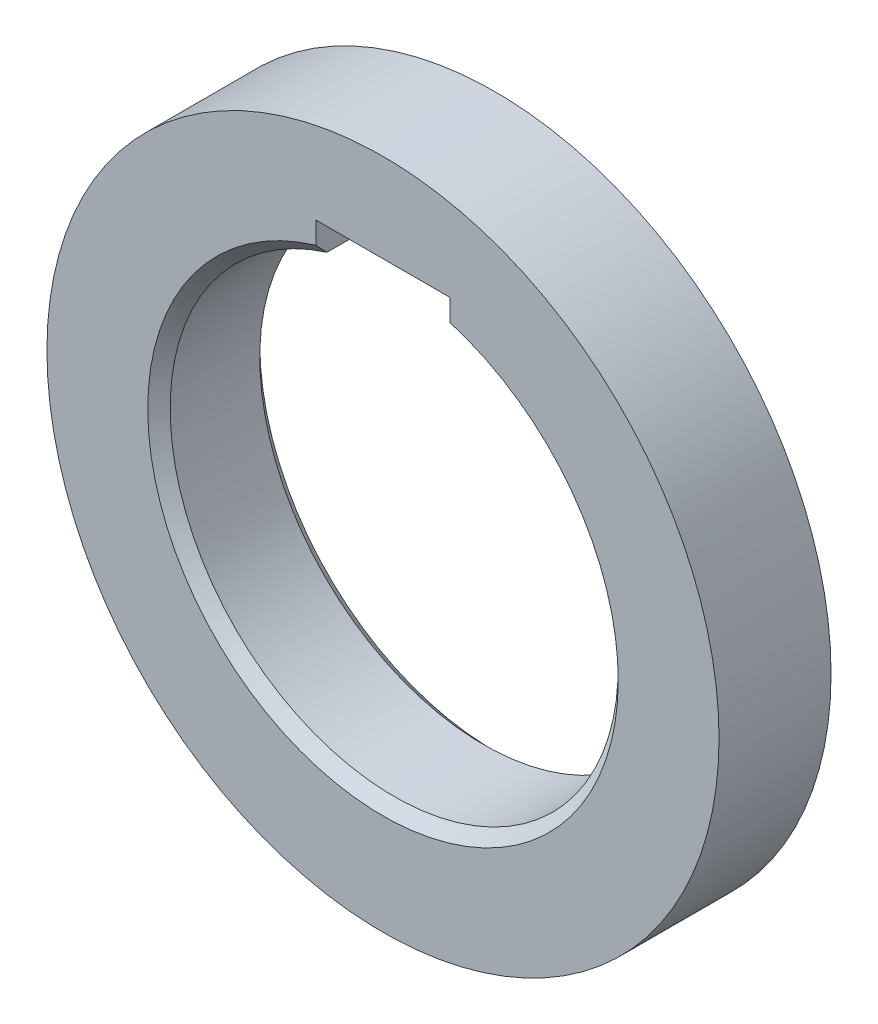
ISO-10303-21;
HEADER;
FILE_DESCRIPTION(('STEP AP214'),'2;1');
FILE_NAME('part.step','',(''),(''),'','','');
FILE_SCHEMA(('AUTOMOTIVE_DESIGN { 1 0 10303 214 1 1 1 1 }'));
ENDSEC;
DATA;
#1=APPLICATION_CONTEXT('core data for automotive mechanical design processes');
#2=APPLICATION_PROTOCOL_DEFINITION('international standard','automotive_design',2000,#1);
#3=PRODUCT_CONTEXT('',#1,'mechanical');
#4=PRODUCT('Part','Part','',(#3));
#5=PRODUCT_RELATED_PRODUCT_CATEGORY('part','',(#4));
#6=PRODUCT_DEFINITION_FORMATION('','',#4);
#7=PRODUCT_DEFINITION_CONTEXT('part definition',#1,'design');
#8=PRODUCT_DEFINITION('design','',#6,#7);
#9=PRODUCT_DEFINITION_SHAPE('','',#8);
#10=(LENGTH_UNIT() NAMED_UNIT(*) SI_UNIT(.MILLI.,.METRE.));
#11=(NAMED_UNIT(*) PLANE_ANGLE_UNIT() SI_UNIT($,.RADIAN.));
#12=(NAMED_UNIT(*) SI_UNIT($,.STERADIAN.) SOLID_ANGLE_UNIT());
#13=UNCERTAINTY_MEASURE_WITH_UNIT(LENGTH_MEASURE(1.E-05),#10,'distance_accuracy_value','');
#14=(GEOMETRIC_REPRESENTATION_CONTEXT(3) GLOBAL_UNCERTAINTY_ASSIGNED_CONTEXT((#13)) GLOBAL_UNIT_ASSIGNED_CONTEXT((#10,
#11,#12)) REPRESENTATION_CONTEXT('',''));
#15=CARTESIAN_POINT('',(0.,0.,0.));
#16=DIRECTION('',(0.,0.,1.));
#17=DIRECTION('',(1.,0.,0.));
#18=AXIS2_PLACEMENT_3D('',#15,#16,#17);
#19=CARTESIAN_POINT('',(0.,0.,-10.));
#20=DIRECTION('',(0.,0.,1.));
#21=DIRECTION('',(1.,0.,0.));
#22=AXIS2_PLACEMENT_3D('',#19,#20,#21);
#23=CYLINDRICAL_SURFACE('',#22,20.);
#24=DIRECTION('',(0.,0.,1.));
#25=VECTOR('',#24,1.);
#26=CARTESIAN_POINT('',(6.,19.0787840283389,-10.));
#27=LINE('',#26,#25);
#28=CARTESIAN_POINT('',(6.,19.0787840283389,-8.99999999999999));
#29=VERTEX_POINT('',#28);
#30=CARTESIAN_POINT('',(6.,19.0787840283389,-0.999999999999994));
#31=VERTEX_POINT('',#30);
#32=EDGE_CURVE('E127',#29,#31,#27,.T.);
#33=ORIENTED_EDGE('',*,*,#32,.F.);
#34=CARTESIAN_POINT('',(0.,0.,-8.99999999999999));
#35=DIRECTION('',(0.,0.,1.));
#36=DIRECTION('',(1.,0.,0.));
#37=AXIS2_PLACEMENT_3D('',#34,#35,#36);
#38=CIRCLE('',#37,20.);
#39=CARTESIAN_POINT('',(-6.,19.0787840283389,-8.99999999999999));
#40=VERTEX_POINT('',#39);
#41=EDGE_CURVE('E186',#29,#40,#38,.F.);
#42=ORIENTED_EDGE('',*,*,#41,.T.);
#43=DIRECTION('',(0.,0.,1.));
#44=VECTOR('',#43,1.);
#45=CARTESIAN_POINT('',(-6.,19.0787840283389,-10.));
#46=LINE('',#45,#44);
#47=CARTESIAN_POINT('',(-6.,19.0787840283389,-0.999999999999994));
#48=VERTEX_POINT('',#47);
#49=EDGE_CURVE('E107',#40,#48,#46,.T.);
#50=ORIENTED_EDGE('',*,*,#49,.T.);
#51=CARTESIAN_POINT('',(0.,0.,-0.999999999999994));
#52=DIRECTION('',(0.,0.,1.));
#53=DIRECTION('',(1.,0.,0.));
#54=AXIS2_PLACEMENT_3D('',#51,#52,#53);
#55=CIRCLE('',#54,20.);
#56=EDGE_CURVE('E188',#48,#31,#55,.T.);
#57=ORIENTED_EDGE('',*,*,#56,.T.);
#58=EDGE_LOOP('',(#33,#42,#50,#57));
#59=FACE_BOUND('',#58,.T.);
#60=ADVANCED_FACE('F34',(#59),#23,.F.);
#61=CARTESIAN_POINT('',(6.,0.,-10.));
#62=DIRECTION('',(1.,0.,0.));
#63=DIRECTION('',(0.,0.,-1.));
#64=AXIS2_PLACEMENT_3D('',#61,#62,#63);
#65=PLANE('',#64);
#66=DIRECTION('',(0.,1.,0.));
#67=VECTOR('',#66,1.);
#68=CARTESIAN_POINT('',(6.,0.,-10.));
#69=LINE('',#68,#67);
#70=CARTESIAN_POINT('',(6.,20.1246117974981,-10.));
#71=VERTEX_POINT('',#70);
#72=CARTESIAN_POINT('',(6.,22.0787840283389,-10.));
#73=VERTEX_POINT('',#72);
#74=EDGE_CURVE('E112',#71,#73,#69,.T.);
#75=ORIENTED_EDGE('',*,*,#74,.F.);
#76=CARTESIAN_POINT('',(6.,20.1246117974981,-10.));
#77=CARTESIAN_POINT('',(6.,19.9504975400754,-9.83313424107122));
#78=CARTESIAN_POINT('',(6.,19.7762880979616,-9.66636802893566));
#79=CARTESIAN_POINT('',(6.,19.4276788415782,-9.33303469559915));
#80=CARTESIAN_POINT('',(6.,19.2532790273057,-9.16646757440138));
#81=CARTESIAN_POINT('',(6.,19.0787840283389,-8.99999999999999));
#82=B_SPLINE_CURVE_WITH_KNOTS('',3,(#76,#77,#78,#79,#80,#81),.UNSPECIFIED.,.F.,.F.,(4,2,4),(0.,
0.723490907396185,1.44698182630377),.UNSPECIFIED.);
#83=EDGE_CURVE('E140',#71,#29,#82,.T.);
#84=ORIENTED_EDGE('',*,*,#83,.T.);
#85=ORIENTED_EDGE('',*,*,#32,.T.);
#86=CARTESIAN_POINT('',(6.,19.0787840283389,-0.999999999999994));
#87=CARTESIAN_POINT('',(6.,19.2532790273057,-0.833532425598612));
#88=CARTESIAN_POINT('',(6.,19.4276788415782,-0.666965304400841));
#89=CARTESIAN_POINT('',(6.,19.7762880979616,-0.333631971064342));
#90=CARTESIAN_POINT('',(6.,19.9504975400754,-0.16686575892878));
#91=CARTESIAN_POINT('',(6.,20.1246117974981,0.));
#92=B_SPLINE_CURVE_WITH_KNOTS('',3,(#86,#87,#88,#89,#90,#91),.UNSPECIFIED.,.F.,.F.,(4,2,4),(0.,
0.723490918907573,1.44698182630375),.UNSPECIFIED.);
#93=CARTESIAN_POINT('',(6.,20.1246117974981,0.));
#94=VERTEX_POINT('',#93);
#95=EDGE_CURVE('E134',#31,#94,#92,.T.);
#96=ORIENTED_EDGE('',*,*,#95,.T.);
#97=DIRECTION('',(0.,1.,0.));
#98=VECTOR('',#97,1.);
#99=CARTESIAN_POINT('',(6.,0.,0.));
#100=LINE('',#99,#98);
#101=CARTESIAN_POINT('',(6.,22.0787840283389,0.));
#102=VERTEX_POINT('',#101);
#103=EDGE_CURVE('E123',#94,#102,#100,.T.);
#104=ORIENTED_EDGE('',*,*,#103,.T.);
#105=DIRECTION('',(0.,0.,1.));
#106=VECTOR('',#105,1.);
#107=CARTESIAN_POINT('',(6.,22.0787840283389,-10.));
#108=LINE('',#107,#106);
#109=EDGE_CURVE('E106',#73,#102,#108,.T.);
#110=ORIENTED_EDGE('',*,*,#109,.F.);
#111=EDGE_LOOP('',(#75,#84,#85,#96,#104,#110));
#112=FACE_BOUND('',#111,.T.);
#113=ADVANCED_FACE('F145',(#112),#65,.F.);
#114=CARTESIAN_POINT('',(0.,22.0787840283389,-10.));
#115=DIRECTION('',(0.,-1.,0.));
#116=DIRECTION('',(0.,0.,-1.));
#117=AXIS2_PLACEMENT_3D('',#114,#115,#116);
#118=PLANE('',#117);
#119=DIRECTION('',(1.,0.,0.));
#120=VECTOR('',#119,1.);
#121=CARTESIAN_POINT('',(0.,22.0787840283389,0.));
#122=LINE('',#121,#120);
#123=CARTESIAN_POINT('',(-6.,22.0787840283389,0.));
#124=VERTEX_POINT('',#123);
#125=EDGE_CURVE('E105',#124,#102,#122,.T.);
#126=ORIENTED_EDGE('',*,*,#125,.F.);
#127=DIRECTION('',(0.,0.,1.));
#128=VECTOR('',#127,1.);
#129=CARTESIAN_POINT('',(-6.,22.0787840283389,-10.));
#130=LINE('',#129,#128);
#131=CARTESIAN_POINT('',(-6.,22.0787840283389,-10.));
#132=VERTEX_POINT('',#131);
#133=EDGE_CURVE('E90',#132,#124,#130,.T.);
#134=ORIENTED_EDGE('',*,*,#133,.F.);
#135=DIRECTION('',(1.,0.,0.));
#136=VECTOR('',#135,1.);
#137=CARTESIAN_POINT('',(0.,22.0787840283389,-10.));
#138=LINE('',#137,#136);
#139=EDGE_CURVE('E97',#132,#73,#138,.T.);
#140=ORIENTED_EDGE('',*,*,#139,.T.);
#141=ORIENTED_EDGE('',*,*,#109,.T.);
#142=EDGE_LOOP('',(#126,#134,#140,#141));
#143=FACE_BOUND('',#142,.T.);
#144=ADVANCED_FACE('F102',(#143),#118,.T.);
#145=CARTESIAN_POINT('',(-6.,0.,-10.));
#146=DIRECTION('',(1.,0.,0.));
#147=DIRECTION('',(0.,0.,-1.));
#148=AXIS2_PLACEMENT_3D('',#145,#146,#147);
#149=PLANE('',#148);
#150=ORIENTED_EDGE('',*,*,#49,.F.);
#151=CARTESIAN_POINT('',(-6.,19.0787840283389,-8.99999999999999));
#152=CARTESIAN_POINT('',(-6.,19.2532790273057,-9.16646757440138));
#153=CARTESIAN_POINT('',(-6.,19.4276788415782,-9.33303469559915));
#154=CARTESIAN_POINT('',(-6.,19.7762880979616,-9.66636802893566));
#155=CARTESIAN_POINT('',(-6.,19.9504975400754,-9.83313424107122));
#156=CARTESIAN_POINT('',(-6.,20.1246117974981,-10.));
#157=B_SPLINE_CURVE_WITH_KNOTS('',3,(#151,#152,#153,#154,#155,#156),.UNSPECIFIED.,.F.,.F.,(4,2,
4),(0.,0.72349091890758,1.44698182630377),.UNSPECIFIED.);
#158=CARTESIAN_POINT('',(-6.,20.1246117974981,-10.));
#159=VERTEX_POINT('',#158);
#160=EDGE_CURVE('E43',#40,#159,#157,.T.);
#161=ORIENTED_EDGE('',*,*,#160,.T.);
#162=DIRECTION('',(0.,1.,0.));
#163=VECTOR('',#162,1.);
#164=CARTESIAN_POINT('',(-6.,0.,-10.));
#165=LINE('',#164,#163);
#166=EDGE_CURVE('E87',#159,#132,#165,.T.);
#167=ORIENTED_EDGE('',*,*,#166,.T.);
#168=ORIENTED_EDGE('',*,*,#133,.T.);
#169=DIRECTION('',(0.,1.,0.));
#170=VECTOR('',#169,1.);
#171=CARTESIAN_POINT('',(-6.,0.,0.));
#172=LINE('',#171,#170);
#173=CARTESIAN_POINT('',(-6.,20.1246117974981,0.));
#174=VERTEX_POINT('',#173);
#175=EDGE_CURVE('E120',#174,#124,#172,.T.);
#176=ORIENTED_EDGE('',*,*,#175,.F.);
#177=CARTESIAN_POINT('',(-6.,20.1246117974981,0.));
#178=CARTESIAN_POINT('',(-6.,19.9504975400754,-0.166865758928779));
#179=CARTESIAN_POINT('',(-6.,19.7762880979616,-0.333631971064339));
#180=CARTESIAN_POINT('',(-6.,19.4276788415782,-0.666965304400839));
#181=CARTESIAN_POINT('',(-6.,19.2532790273057,-0.833532425598611));
#182=CARTESIAN_POINT('',(-6.,19.0787840283389,-0.999999999999995));
#183=B_SPLINE_CURVE_WITH_KNOTS('',3,(#177,#178,#179,#180,#181,#182),.UNSPECIFIED.,.F.,.F.,(4,2,
4),(0.,0.72349090739618,1.44698182630376),.UNSPECIFIED.);
#184=EDGE_CURVE('E55',#174,#48,#183,.T.);
#185=ORIENTED_EDGE('',*,*,#184,.T.);
#186=EDGE_LOOP('',(#150,#161,#167,#168,#176,#185));
#187=FACE_BOUND('',#186,.T.);
#188=ADVANCED_FACE('F89',(#187),#149,.T.);
#189=CARTESIAN_POINT('',(0.,0.,-10.));
#190=DIRECTION('',(0.,0.,1.));
#191=DIRECTION('',(1.,0.,0.));
#192=AXIS2_PLACEMENT_3D('',#189,#190,#191);
#193=CYLINDRICAL_SURFACE('',#192,30.);
#194=CARTESIAN_POINT('',(0.,0.,-10.));
#195=DIRECTION('',(0.,0.,1.));
#196=DIRECTION('',(1.,0.,0.));
#197=AXIS2_PLACEMENT_3D('',#194,#195,#196);
#198=CIRCLE('',#197,30.);
#199=CARTESIAN_POINT('',(30.,0.,-10.));
#200=VERTEX_POINT('',#199);
#201=EDGE_CURVE('E115',#200,#200,#198,.T.);
#202=ORIENTED_EDGE('',*,*,#201,.T.);
#203=EDGE_LOOP('',(#202));
#204=FACE_BOUND('',#203,.T.);
#205=CARTESIAN_POINT('',(0.,0.,0.));
#206=DIRECTION('',(0.,0.,1.));
#207=DIRECTION('',(1.,0.,0.));
#208=AXIS2_PLACEMENT_3D('',#205,#206,#207);
#209=CIRCLE('',#208,30.);
#210=CARTESIAN_POINT('',(30.,0.,0.));
#211=VERTEX_POINT('',#210);
#212=EDGE_CURVE('E98',#211,#211,#209,.T.);
#213=ORIENTED_EDGE('',*,*,#212,.F.);
#214=EDGE_LOOP('',(#213));
#215=FACE_BOUND('',#214,.T.);
#216=ADVANCED_FACE('F151',(#204,#215),#193,.T.);
#217=CARTESIAN_POINT('',(0.,0.,-10.));
#218=DIRECTION('',(0.,0.,1.));
#219=DIRECTION('',(1.,0.,0.));
#220=AXIS2_PLACEMENT_3D('',#217,#218,#219);
#221=PLANE('',#220);
#222=ORIENTED_EDGE('',*,*,#166,.F.);
#223=CARTESIAN_POINT('',(0.,0.,-10.));
#224=DIRECTION('',(0.,0.,1.));
#225=DIRECTION('',(1.,0.,0.));
#226=AXIS2_PLACEMENT_3D('',#223,#224,#225);
#227=CIRCLE('',#226,21.);
#228=EDGE_CURVE('E130',#159,#71,#227,.T.);
#229=ORIENTED_EDGE('',*,*,#228,.T.);
#230=ORIENTED_EDGE('',*,*,#74,.T.);
#231=ORIENTED_EDGE('',*,*,#139,.F.);
#232=EDGE_LOOP('',(#222,#229,#230,#231));
#233=FACE_BOUND('',#232,.T.);
#234=ORIENTED_EDGE('',*,*,#201,.F.);
#235=EDGE_LOOP('',(#234));
#236=FACE_BOUND('',#235,.T.);
#237=ADVANCED_FACE('F109',(#233,#236),#221,.F.);
#238=CARTESIAN_POINT('',(0.,0.,0.));
#239=DIRECTION('',(0.,0.,1.));
#240=DIRECTION('',(1.,0.,0.));
#241=AXIS2_PLACEMENT_3D('',#238,#239,#240);
#242=PLANE('',#241);
#243=ORIENTED_EDGE('',*,*,#103,.F.);
#244=CARTESIAN_POINT('',(0.,0.,0.));
#245=DIRECTION('',(0.,0.,1.));
#246=DIRECTION('',(1.,0.,0.));
#247=AXIS2_PLACEMENT_3D('',#244,#245,#246);
#248=CIRCLE('',#247,21.);
#249=EDGE_CURVE('E11',#94,#174,#248,.F.);
#250=ORIENTED_EDGE('',*,*,#249,.T.);
#251=ORIENTED_EDGE('',*,*,#175,.T.);
#252=ORIENTED_EDGE('',*,*,#125,.T.);
#253=EDGE_LOOP('',(#243,#250,#251,#252));
#254=FACE_BOUND('',#253,.T.);
#255=ORIENTED_EDGE('',*,*,#212,.T.);
#256=EDGE_LOOP('',(#255));
#257=FACE_BOUND('',#256,.T.);
#258=ADVANCED_FACE('F171',(#254,#257),#242,.T.);
#259=CARTESIAN_POINT('',(0.,0.,-10.));
#260=DIRECTION('',(0.,0.,-1.));
#261=DIRECTION('',(-1.,0.,0.));
#262=AXIS2_PLACEMENT_3D('',#259,#260,#261);
#263=CONICAL_SURFACE('',#262,21.,0.785398163397448);
#264=ORIENTED_EDGE('',*,*,#160,.F.);
#265=ORIENTED_EDGE('',*,*,#41,.F.);
#266=ORIENTED_EDGE('',*,*,#83,.F.);
#267=ORIENTED_EDGE('',*,*,#228,.F.);
#268=EDGE_LOOP('',(#264,#265,#266,#267));
#269=FACE_BOUND('',#268,.T.);
#270=ADVANCED_FACE('F168',(#269),#263,.F.);
#271=CARTESIAN_POINT('',(0.,0.,-0.999999999999994));
#272=DIRECTION('',(0.,0.,1.));
#273=DIRECTION('',(1.,0.,0.));
#274=AXIS2_PLACEMENT_3D('',#271,#272,#273);
#275=CONICAL_SURFACE('',#274,20.,0.785398163397455);
#276=ORIENTED_EDGE('',*,*,#184,.F.);
#277=ORIENTED_EDGE('',*,*,#249,.F.);
#278=ORIENTED_EDGE('',*,*,#95,.F.);
#279=ORIENTED_EDGE('',*,*,#56,.F.);
#280=EDGE_LOOP('',(#276,#277,#278,#279));
#281=FACE_BOUND('',#280,.T.);
#282=ADVANCED_FACE('F36',(#281),#275,.F.);
#283=CLOSED_SHELL('',(#60,#113,#144,#188,#216,#237,#258,#270,#282));
#284=MANIFOLD_SOLID_BREP('B2',#283);
#285=ADVANCED_BREP_SHAPE_REPRESENTATION('',(#18,#284),#14);
#286=SHAPE_DEFINITION_REPRESENTATION(#9,#285);
ENDSEC;
END-ISO-10303-21;
